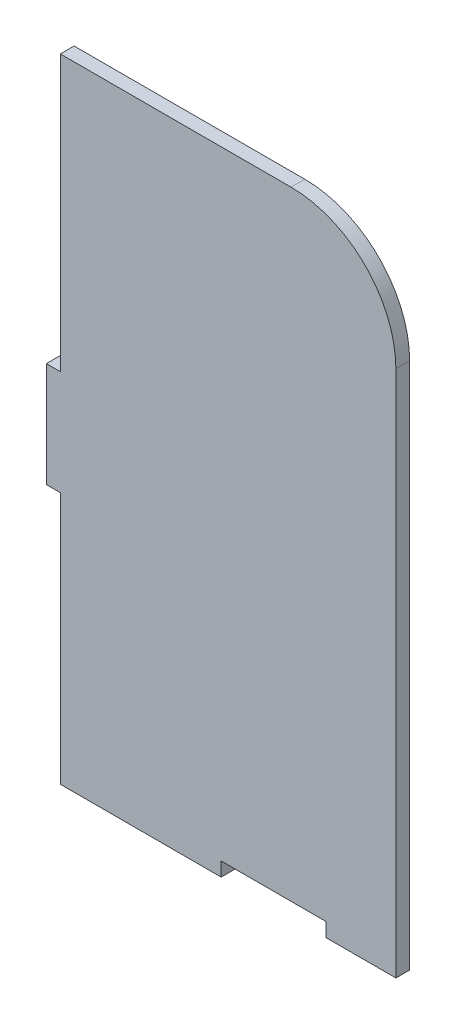
ISO-10303-21;
HEADER;
FILE_DESCRIPTION(('STEP AP214'),'2;1');
FILE_NAME('part.step','',(''),(''),'','','');
FILE_SCHEMA(('AUTOMOTIVE_DESIGN { 1 0 10303 214 1 1 1 1 }'));
ENDSEC;
DATA;
#1=APPLICATION_CONTEXT('core data for automotive mechanical design processes');
#2=APPLICATION_PROTOCOL_DEFINITION('international standard','automotive_design',2000,#1);
#3=PRODUCT_CONTEXT('',#1,'mechanical');
#4=PRODUCT('Part','Part','',(#3));
#5=PRODUCT_RELATED_PRODUCT_CATEGORY('part','',(#4));
#6=PRODUCT_DEFINITION_FORMATION('','',#4);
#7=PRODUCT_DEFINITION_CONTEXT('part definition',#1,'design');
#8=PRODUCT_DEFINITION('design','',#6,#7);
#9=PRODUCT_DEFINITION_SHAPE('','',#8);
#10=(LENGTH_UNIT() NAMED_UNIT(*) SI_UNIT(.MILLI.,.METRE.));
#11=(NAMED_UNIT(*) PLANE_ANGLE_UNIT() SI_UNIT($,.RADIAN.));
#12=(NAMED_UNIT(*) SI_UNIT($,.STERADIAN.) SOLID_ANGLE_UNIT());
#13=UNCERTAINTY_MEASURE_WITH_UNIT(LENGTH_MEASURE(1.E-05),#10,'distance_accuracy_value','');
#14=(GEOMETRIC_REPRESENTATION_CONTEXT(3) GLOBAL_UNCERTAINTY_ASSIGNED_CONTEXT((#13)) GLOBAL_UNIT_ASSIGNED_CONTEXT((#10,
#11,#12)) REPRESENTATION_CONTEXT('',''));
#15=CARTESIAN_POINT('',(0.,0.,0.));
#16=DIRECTION('',(0.,0.,1.));
#17=DIRECTION('',(1.,0.,0.));
#18=AXIS2_PLACEMENT_3D('',#15,#16,#17);
#19=CARTESIAN_POINT('',(215.829586762206,-10.1600000000001,-10.));
#20=DIRECTION('',(-1.,0.,0.));
#21=DIRECTION('',(0.,0.,1.));
#22=AXIS2_PLACEMENT_3D('',#19,#20,#21);
#23=PLANE('',#22);
#24=DIRECTION('',(0.,-1.,0.));
#25=VECTOR('',#24,1.);
#26=CARTESIAN_POINT('',(215.829586762206,-10.1600000000001,0.));
#27=LINE('',#26,#25);
#28=CARTESIAN_POINT('',(215.829586762206,-10.1600000000001,0.));
#29=VERTEX_POINT('',#28);
#30=CARTESIAN_POINT('',(215.829586762206,-210.16,0.));
#31=VERTEX_POINT('',#30);
#32=EDGE_CURVE('E164',#29,#31,#27,.T.);
#33=ORIENTED_EDGE('',*,*,#32,.F.);
#34=DIRECTION('',(0.,0.,1.));
#35=VECTOR('',#34,1.);
#36=CARTESIAN_POINT('',(215.829586762206,-10.1600000000001,-10.));
#37=LINE('',#36,#35);
#38=CARTESIAN_POINT('',(215.829586762206,-10.1600000000001,-10.));
#39=VERTEX_POINT('',#38);
#40=EDGE_CURVE('E11',#39,#29,#37,.T.);
#41=ORIENTED_EDGE('',*,*,#40,.F.);
#42=DIRECTION('',(0.,-1.,0.));
#43=VECTOR('',#42,1.);
#44=CARTESIAN_POINT('',(215.829586762206,-10.1600000000001,-10.));
#45=LINE('',#44,#43);
#46=CARTESIAN_POINT('',(215.829586762206,-210.16,-10.));
#47=VERTEX_POINT('',#46);
#48=EDGE_CURVE('E199',#39,#47,#45,.T.);
#49=ORIENTED_EDGE('',*,*,#48,.T.);
#50=DIRECTION('',(0.,0.,1.));
#51=VECTOR('',#50,1.);
#52=CARTESIAN_POINT('',(215.829586762206,-210.16,-10.));
#53=LINE('',#52,#51);
#54=EDGE_CURVE('E40',#47,#31,#53,.T.);
#55=ORIENTED_EDGE('',*,*,#54,.T.);
#56=EDGE_LOOP('',(#33,#41,#49,#55));
#57=FACE_BOUND('',#56,.T.);
#58=ADVANCED_FACE('F37',(#57),#23,.T.);
#59=CARTESIAN_POINT('',(215.829586762206,-10.1600000000001,-10.));
#60=DIRECTION('',(0.,1.,0.));
#61=DIRECTION('',(0.,0.,1.));
#62=AXIS2_PLACEMENT_3D('',#59,#60,#61);
#63=PLANE('',#62);
#64=DIRECTION('',(-1.,0.,0.));
#65=VECTOR('',#64,1.);
#66=CARTESIAN_POINT('',(215.829586762206,-10.1600000000001,0.));
#67=LINE('',#66,#65);
#68=CARTESIAN_POINT('',(383.521789204401,-10.1600000000001,0.));
#69=VERTEX_POINT('',#68);
#70=EDGE_CURVE('E197',#69,#29,#67,.T.);
#71=ORIENTED_EDGE('',*,*,#70,.F.);
#72=DIRECTION('',(0.,0.,1.));
#73=VECTOR('',#72,1.);
#74=CARTESIAN_POINT('',(383.521789204401,-10.1600000000001,-10.));
#75=LINE('',#74,#73);
#76=CARTESIAN_POINT('',(383.521789204401,-10.1600000000001,-10.));
#77=VERTEX_POINT('',#76);
#78=EDGE_CURVE('E46',#77,#69,#75,.T.);
#79=ORIENTED_EDGE('',*,*,#78,.F.);
#80=DIRECTION('',(-1.,0.,0.));
#81=VECTOR('',#80,1.);
#82=CARTESIAN_POINT('',(215.829586762206,-10.1600000000001,-10.));
#83=LINE('',#82,#81);
#84=EDGE_CURVE('E154',#77,#39,#83,.T.);
#85=ORIENTED_EDGE('',*,*,#84,.T.);
#86=ORIENTED_EDGE('',*,*,#40,.T.);
#87=EDGE_LOOP('',(#71,#79,#85,#86));
#88=FACE_BOUND('',#87,.T.);
#89=ADVANCED_FACE('F221',(#88),#63,.T.);
#90=CARTESIAN_POINT('',(383.521789204401,-86.3600000000001,-10.));
#91=DIRECTION('',(0.,0.,1.));
#92=DIRECTION('',(1.,0.,0.));
#93=AXIS2_PLACEMENT_3D('',#90,#91,#92);
#94=CYLINDRICAL_SURFACE('',#93,76.2);
#95=CARTESIAN_POINT('',(383.521789204401,-86.3600000000001,0.));
#96=DIRECTION('',(0.,0.,1.));
#97=DIRECTION('',(1.,0.,0.));
#98=AXIS2_PLACEMENT_3D('',#95,#96,#97);
#99=CIRCLE('',#98,76.2);
#100=CARTESIAN_POINT('',(459.721789204401,-86.3600000000001,0.));
#101=VERTEX_POINT('',#100);
#102=EDGE_CURVE('E141',#101,#69,#99,.T.);
#103=ORIENTED_EDGE('',*,*,#102,.F.);
#104=DIRECTION('',(0.,0.,1.));
#105=VECTOR('',#104,1.);
#106=CARTESIAN_POINT('',(459.721789204401,-86.3600000000001,-10.));
#107=LINE('',#106,#105);
#108=CARTESIAN_POINT('',(459.721789204401,-86.3600000000001,-10.));
#109=VERTEX_POINT('',#108);
#110=EDGE_CURVE('E136',#109,#101,#107,.T.);
#111=ORIENTED_EDGE('',*,*,#110,.F.);
#112=CARTESIAN_POINT('',(383.521789204401,-86.3600000000001,-10.));
#113=DIRECTION('',(0.,0.,1.));
#114=DIRECTION('',(1.,0.,0.));
#115=AXIS2_PLACEMENT_3D('',#112,#113,#114);
#116=CIRCLE('',#115,76.2);
#117=EDGE_CURVE('E139',#109,#77,#116,.T.);
#118=ORIENTED_EDGE('',*,*,#117,.T.);
#119=ORIENTED_EDGE('',*,*,#78,.T.);
#120=EDGE_LOOP('',(#103,#111,#118,#119));
#121=FACE_BOUND('',#120,.T.);
#122=ADVANCED_FACE('F138',(#121),#94,.T.);
#123=CARTESIAN_POINT('',(459.721789204401,-86.3600000000001,-10.));
#124=DIRECTION('',(1.,0.,0.));
#125=DIRECTION('',(0.,0.,-1.));
#126=AXIS2_PLACEMENT_3D('',#123,#124,#125);
#127=PLANE('',#126);
#128=DIRECTION('',(0.,1.,0.));
#129=VECTOR('',#128,1.);
#130=CARTESIAN_POINT('',(459.721789204401,-86.3600000000001,0.));
#131=LINE('',#130,#129);
#132=CARTESIAN_POINT('',(459.721789204401,-469.899999999951,0.));
#133=VERTEX_POINT('',#132);
#134=EDGE_CURVE('E194',#133,#101,#131,.T.);
#135=ORIENTED_EDGE('',*,*,#134,.F.);
#136=DIRECTION('',(0.,0.,1.));
#137=VECTOR('',#136,1.);
#138=CARTESIAN_POINT('',(459.721789204401,-469.899999999951,-10.));
#139=LINE('',#138,#137);
#140=CARTESIAN_POINT('',(459.721789204401,-469.899999999951,-10.));
#141=VERTEX_POINT('',#140);
#142=EDGE_CURVE('E146',#141,#133,#139,.T.);
#143=ORIENTED_EDGE('',*,*,#142,.F.);
#144=DIRECTION('',(0.,1.,0.));
#145=VECTOR('',#144,1.);
#146=CARTESIAN_POINT('',(459.721789204401,-86.3600000000001,-10.));
#147=LINE('',#146,#145);
#148=EDGE_CURVE('E152',#141,#109,#147,.T.);
#149=ORIENTED_EDGE('',*,*,#148,.T.);
#150=ORIENTED_EDGE('',*,*,#110,.T.);
#151=EDGE_LOOP('',(#135,#143,#149,#150));
#152=FACE_BOUND('',#151,.T.);
#153=ADVANCED_FACE('F156',(#152),#127,.T.);
#154=CARTESIAN_POINT('',(408.9217892044,-469.899999999951,-10.));
#155=DIRECTION('',(0.,-1.,0.));
#156=DIRECTION('',(1.,0.,0.));
#157=AXIS2_PLACEMENT_3D('',#154,#155,#156);
#158=PLANE('',#157);
#159=DIRECTION('',(1.,0.,0.));
#160=VECTOR('',#159,1.);
#161=CARTESIAN_POINT('',(408.9217892044,-469.899999999951,0.));
#162=LINE('',#161,#160);
#163=CARTESIAN_POINT('',(408.9217892044,-469.899999999951,0.));
#164=VERTEX_POINT('',#163);
#165=EDGE_CURVE('E191',#164,#133,#162,.T.);
#166=ORIENTED_EDGE('',*,*,#165,.F.);
#167=DIRECTION('',(0.,0.,1.));
#168=VECTOR('',#167,1.);
#169=CARTESIAN_POINT('',(408.9217892044,-469.899999999951,-10.));
#170=LINE('',#169,#168);
#171=CARTESIAN_POINT('',(408.9217892044,-469.899999999951,-10.));
#172=VERTEX_POINT('',#171);
#173=EDGE_CURVE('E203',#172,#164,#170,.T.);
#174=ORIENTED_EDGE('',*,*,#173,.F.);
#175=DIRECTION('',(1.,0.,0.));
#176=VECTOR('',#175,1.);
#177=CARTESIAN_POINT('',(408.9217892044,-469.899999999951,-10.));
#178=LINE('',#177,#176);
#179=EDGE_CURVE('E157',#172,#141,#178,.T.);
#180=ORIENTED_EDGE('',*,*,#179,.T.);
#181=ORIENTED_EDGE('',*,*,#142,.T.);
#182=EDGE_LOOP('',(#166,#174,#180,#181));
#183=FACE_BOUND('',#182,.T.);
#184=ADVANCED_FACE('F234',(#183),#158,.T.);
#185=CARTESIAN_POINT('',(408.9217892044,-469.899999999951,-10.));
#186=DIRECTION('',(-1.,0.,0.));
#187=DIRECTION('',(0.,0.,1.));
#188=AXIS2_PLACEMENT_3D('',#185,#186,#187);
#189=PLANE('',#188);
#190=DIRECTION('',(0.,-1.,0.));
#191=VECTOR('',#190,1.);
#192=CARTESIAN_POINT('',(408.9217892044,-469.899999999951,0.));
#193=LINE('',#192,#191);
#194=CARTESIAN_POINT('',(408.9217892044,-459.73999999995,0.));
#195=VERTEX_POINT('',#194);
#196=EDGE_CURVE('E188',#195,#164,#193,.T.);
#197=ORIENTED_EDGE('',*,*,#196,.F.);
#198=DIRECTION('',(0.,0.,1.));
#199=VECTOR('',#198,1.);
#200=CARTESIAN_POINT('',(408.9217892044,-459.73999999995,-10.));
#201=LINE('',#200,#199);
#202=CARTESIAN_POINT('',(408.9217892044,-459.73999999995,-10.));
#203=VERTEX_POINT('',#202);
#204=EDGE_CURVE('E205',#203,#195,#201,.T.);
#205=ORIENTED_EDGE('',*,*,#204,.F.);
#206=DIRECTION('',(0.,-1.,0.));
#207=VECTOR('',#206,1.);
#208=CARTESIAN_POINT('',(408.9217892044,-469.899999999951,-10.));
#209=LINE('',#208,#207);
#210=EDGE_CURVE('E159',#203,#172,#209,.T.);
#211=ORIENTED_EDGE('',*,*,#210,.T.);
#212=ORIENTED_EDGE('',*,*,#173,.T.);
#213=EDGE_LOOP('',(#197,#205,#211,#212));
#214=FACE_BOUND('',#213,.T.);
#215=ADVANCED_FACE('F237',(#214),#189,.T.);
#216=CARTESIAN_POINT('',(408.9217892044,-459.73999999995,-10.));
#217=DIRECTION('',(0.,-1.,0.));
#218=DIRECTION('',(0.,0.,-1.));
#219=AXIS2_PLACEMENT_3D('',#216,#217,#218);
#220=PLANE('',#219);
#221=DIRECTION('',(1.,0.,0.));
#222=VECTOR('',#221,1.);
#223=CARTESIAN_POINT('',(408.9217892044,-459.73999999995,0.));
#224=LINE('',#223,#222);
#225=CARTESIAN_POINT('',(332.7217892044,-459.73999999995,0.));
#226=VERTEX_POINT('',#225);
#227=EDGE_CURVE('E185',#226,#195,#224,.T.);
#228=ORIENTED_EDGE('',*,*,#227,.F.);
#229=DIRECTION('',(0.,0.,1.));
#230=VECTOR('',#229,1.);
#231=CARTESIAN_POINT('',(332.7217892044,-459.73999999995,-10.));
#232=LINE('',#231,#230);
#233=CARTESIAN_POINT('',(332.7217892044,-459.73999999995,-10.));
#234=VERTEX_POINT('',#233);
#235=EDGE_CURVE('E207',#234,#226,#232,.T.);
#236=ORIENTED_EDGE('',*,*,#235,.F.);
#237=DIRECTION('',(1.,0.,0.));
#238=VECTOR('',#237,1.);
#239=CARTESIAN_POINT('',(408.9217892044,-459.73999999995,-10.));
#240=LINE('',#239,#238);
#241=EDGE_CURVE('E407',#234,#203,#240,.T.);
#242=ORIENTED_EDGE('',*,*,#241,.T.);
#243=ORIENTED_EDGE('',*,*,#204,.T.);
#244=EDGE_LOOP('',(#228,#236,#242,#243));
#245=FACE_BOUND('',#244,.T.);
#246=ADVANCED_FACE('F241',(#245),#220,.T.);
#247=CARTESIAN_POINT('',(332.7217892044,-459.73999999995,-10.));
#248=DIRECTION('',(1.,0.,0.));
#249=DIRECTION('',(0.,0.,-1.));
#250=AXIS2_PLACEMENT_3D('',#247,#248,#249);
#251=PLANE('',#250);
#252=DIRECTION('',(0.,1.,0.));
#253=VECTOR('',#252,1.);
#254=CARTESIAN_POINT('',(332.7217892044,-459.73999999995,0.));
#255=LINE('',#254,#253);
#256=CARTESIAN_POINT('',(332.7217892044,-469.899999999951,0.));
#257=VERTEX_POINT('',#256);
#258=EDGE_CURVE('E182',#257,#226,#255,.T.);
#259=ORIENTED_EDGE('',*,*,#258,.F.);
#260=DIRECTION('',(0.,0.,1.));
#261=VECTOR('',#260,1.);
#262=CARTESIAN_POINT('',(332.7217892044,-469.899999999951,-10.));
#263=LINE('',#262,#261);
#264=CARTESIAN_POINT('',(332.7217892044,-469.899999999951,-10.));
#265=VERTEX_POINT('',#264);
#266=EDGE_CURVE('E209',#265,#257,#263,.T.);
#267=ORIENTED_EDGE('',*,*,#266,.F.);
#268=DIRECTION('',(0.,1.,0.));
#269=VECTOR('',#268,1.);
#270=CARTESIAN_POINT('',(332.7217892044,-459.73999999995,-10.));
#271=LINE('',#270,#269);
#272=EDGE_CURVE('E403',#265,#234,#271,.T.);
#273=ORIENTED_EDGE('',*,*,#272,.T.);
#274=ORIENTED_EDGE('',*,*,#235,.T.);
#275=EDGE_LOOP('',(#259,#267,#273,#274));
#276=FACE_BOUND('',#275,.T.);
#277=ADVANCED_FACE('F245',(#276),#251,.T.);
#278=CARTESIAN_POINT('',(215.829586762206,-469.9,-10.));
#279=DIRECTION('',(4.15055454191755E-13,-1.,0.));
#280=DIRECTION('',(1.,4.15055454191755E-13,0.));
#281=AXIS2_PLACEMENT_3D('',#278,#279,#280);
#282=PLANE('',#281);
#283=DIRECTION('',(1.,4.15055454191755E-13,0.));
#284=VECTOR('',#283,1.);
#285=CARTESIAN_POINT('',(215.829586762206,-469.9,0.));
#286=LINE('',#285,#284);
#287=CARTESIAN_POINT('',(215.829586762206,-469.9,0.));
#288=VERTEX_POINT('',#287);
#289=EDGE_CURVE('E179',#288,#257,#286,.T.);
#290=ORIENTED_EDGE('',*,*,#289,.F.);
#291=DIRECTION('',(0.,0.,1.));
#292=VECTOR('',#291,1.);
#293=CARTESIAN_POINT('',(215.829586762206,-469.9,-10.));
#294=LINE('',#293,#292);
#295=CARTESIAN_POINT('',(215.829586762206,-469.9,-10.));
#296=VERTEX_POINT('',#295);
#297=EDGE_CURVE('E211',#296,#288,#294,.T.);
#298=ORIENTED_EDGE('',*,*,#297,.F.);
#299=DIRECTION('',(1.,4.15055454191755E-13,0.));
#300=VECTOR('',#299,1.);
#301=CARTESIAN_POINT('',(215.829586762206,-469.9,-10.));
#302=LINE('',#301,#300);
#303=EDGE_CURVE('E414',#296,#265,#302,.T.);
#304=ORIENTED_EDGE('',*,*,#303,.T.);
#305=ORIENTED_EDGE('',*,*,#266,.T.);
#306=EDGE_LOOP('',(#290,#298,#304,#305));
#307=FACE_BOUND('',#306,.T.);
#308=ADVANCED_FACE('F249',(#307),#282,.T.);
#309=CARTESIAN_POINT('',(215.829586762206,-286.36,-10.));
#310=DIRECTION('',(-1.,0.,0.));
#311=DIRECTION('',(0.,-1.,0.));
#312=AXIS2_PLACEMENT_3D('',#309,#310,#311);
#313=PLANE('',#312);
#314=DIRECTION('',(0.,-1.,0.));
#315=VECTOR('',#314,1.);
#316=CARTESIAN_POINT('',(215.829586762206,-286.36,0.));
#317=LINE('',#316,#315);
#318=CARTESIAN_POINT('',(215.829586762206,-286.36,0.));
#319=VERTEX_POINT('',#318);
#320=EDGE_CURVE('E176',#319,#288,#317,.T.);
#321=ORIENTED_EDGE('',*,*,#320,.F.);
#322=DIRECTION('',(0.,0.,1.));
#323=VECTOR('',#322,1.);
#324=CARTESIAN_POINT('',(215.829586762206,-286.36,-10.));
#325=LINE('',#324,#323);
#326=CARTESIAN_POINT('',(215.829586762206,-286.36,-10.));
#327=VERTEX_POINT('',#326);
#328=EDGE_CURVE('E213',#327,#319,#325,.T.);
#329=ORIENTED_EDGE('',*,*,#328,.F.);
#330=DIRECTION('',(0.,-1.,0.));
#331=VECTOR('',#330,1.);
#332=CARTESIAN_POINT('',(215.829586762206,-286.36,-10.));
#333=LINE('',#332,#331);
#334=EDGE_CURVE('E396',#327,#296,#333,.T.);
#335=ORIENTED_EDGE('',*,*,#334,.T.);
#336=ORIENTED_EDGE('',*,*,#297,.T.);
#337=EDGE_LOOP('',(#321,#329,#335,#336));
#338=FACE_BOUND('',#337,.T.);
#339=ADVANCED_FACE('F253',(#338),#313,.T.);
#340=CARTESIAN_POINT('',(205.663096360818,-286.36,-10.));
#341=DIRECTION('',(0.,-1.,0.));
#342=DIRECTION('',(1.,0.,0.));
#343=AXIS2_PLACEMENT_3D('',#340,#341,#342);
#344=PLANE('',#343);
#345=DIRECTION('',(1.,0.,0.));
#346=VECTOR('',#345,1.);
#347=CARTESIAN_POINT('',(205.663096360818,-286.36,0.));
#348=LINE('',#347,#346);
#349=CARTESIAN_POINT('',(205.663096360818,-286.36,0.));
#350=VERTEX_POINT('',#349);
#351=EDGE_CURVE('E173',#350,#319,#348,.T.);
#352=ORIENTED_EDGE('',*,*,#351,.F.);
#353=DIRECTION('',(0.,0.,1.));
#354=VECTOR('',#353,1.);
#355=CARTESIAN_POINT('',(205.663096360818,-286.36,-10.));
#356=LINE('',#355,#354);
#357=CARTESIAN_POINT('',(205.663096360818,-286.36,-10.));
#358=VERTEX_POINT('',#357);
#359=EDGE_CURVE('E215',#358,#350,#356,.T.);
#360=ORIENTED_EDGE('',*,*,#359,.F.);
#361=DIRECTION('',(1.,0.,0.));
#362=VECTOR('',#361,1.);
#363=CARTESIAN_POINT('',(205.663096360818,-286.36,-10.));
#364=LINE('',#363,#362);
#365=EDGE_CURVE('E392',#358,#327,#364,.T.);
#366=ORIENTED_EDGE('',*,*,#365,.T.);
#367=ORIENTED_EDGE('',*,*,#328,.T.);
#368=EDGE_LOOP('',(#352,#360,#366,#367));
#369=FACE_BOUND('',#368,.T.);
#370=ADVANCED_FACE('F257',(#369),#344,.T.);
#371=CARTESIAN_POINT('',(205.663096360818,-210.16,-10.));
#372=DIRECTION('',(-1.,0.,0.));
#373=DIRECTION('',(0.,-1.,0.));
#374=AXIS2_PLACEMENT_3D('',#371,#372,#373);
#375=PLANE('',#374);
#376=DIRECTION('',(0.,-1.,0.));
#377=VECTOR('',#376,1.);
#378=CARTESIAN_POINT('',(205.663096360818,-210.16,0.));
#379=LINE('',#378,#377);
#380=CARTESIAN_POINT('',(205.663096360818,-210.16,0.));
#381=VERTEX_POINT('',#380);
#382=EDGE_CURVE('E170',#381,#350,#379,.T.);
#383=ORIENTED_EDGE('',*,*,#382,.F.);
#384=DIRECTION('',(0.,0.,1.));
#385=VECTOR('',#384,1.);
#386=CARTESIAN_POINT('',(205.663096360818,-210.16,-10.));
#387=LINE('',#386,#385);
#388=CARTESIAN_POINT('',(205.663096360818,-210.16,-10.));
#389=VERTEX_POINT('',#388);
#390=EDGE_CURVE('E216',#389,#381,#387,.T.);
#391=ORIENTED_EDGE('',*,*,#390,.F.);
#392=DIRECTION('',(0.,-1.,0.));
#393=VECTOR('',#392,1.);
#394=CARTESIAN_POINT('',(205.663096360818,-210.16,-10.));
#395=LINE('',#394,#393);
#396=EDGE_CURVE('E418',#389,#358,#395,.T.);
#397=ORIENTED_EDGE('',*,*,#396,.T.);
#398=ORIENTED_EDGE('',*,*,#359,.T.);
#399=EDGE_LOOP('',(#383,#391,#397,#398));
#400=FACE_BOUND('',#399,.T.);
#401=ADVANCED_FACE('F261',(#400),#375,.T.);
#402=CARTESIAN_POINT('',(215.829586762206,-210.16,-10.));
#403=DIRECTION('',(0.,1.,0.));
#404=DIRECTION('',(0.,0.,1.));
#405=AXIS2_PLACEMENT_3D('',#402,#403,#404);
#406=PLANE('',#405);
#407=DIRECTION('',(-1.,0.,0.));
#408=VECTOR('',#407,1.);
#409=CARTESIAN_POINT('',(215.829586762206,-210.16,0.));
#410=LINE('',#409,#408);
#411=EDGE_CURVE('E167',#31,#381,#410,.T.);
#412=ORIENTED_EDGE('',*,*,#411,.F.);
#413=ORIENTED_EDGE('',*,*,#54,.F.);
#414=DIRECTION('',(-1.,0.,0.));
#415=VECTOR('',#414,1.);
#416=CARTESIAN_POINT('',(215.829586762206,-210.16,-10.));
#417=LINE('',#416,#415);
#418=EDGE_CURVE('E420',#47,#389,#417,.T.);
#419=ORIENTED_EDGE('',*,*,#418,.T.);
#420=ORIENTED_EDGE('',*,*,#390,.T.);
#421=EDGE_LOOP('',(#412,#413,#419,#420));
#422=FACE_BOUND('',#421,.T.);
#423=ADVANCED_FACE('F218',(#422),#406,.T.);
#424=CARTESIAN_POINT('',(383.521789204401,-86.3600000000001,-10.));
#425=DIRECTION('',(0.,0.,1.));
#426=DIRECTION('',(1.,0.,0.));
#427=AXIS2_PLACEMENT_3D('',#424,#425,#426);
#428=PLANE('',#427);
#429=ORIENTED_EDGE('',*,*,#48,.F.);
#430=ORIENTED_EDGE('',*,*,#84,.F.);
#431=ORIENTED_EDGE('',*,*,#117,.F.);
#432=ORIENTED_EDGE('',*,*,#148,.F.);
#433=ORIENTED_EDGE('',*,*,#179,.F.);
#434=ORIENTED_EDGE('',*,*,#210,.F.);
#435=ORIENTED_EDGE('',*,*,#241,.F.);
#436=ORIENTED_EDGE('',*,*,#272,.F.);
#437=ORIENTED_EDGE('',*,*,#303,.F.);
#438=ORIENTED_EDGE('',*,*,#334,.F.);
#439=ORIENTED_EDGE('',*,*,#365,.F.);
#440=ORIENTED_EDGE('',*,*,#396,.F.);
#441=ORIENTED_EDGE('',*,*,#418,.F.);
#442=EDGE_LOOP('',(#429,#430,#431,#432,#433,#434,#435,#436,#437,#438,#439,#440,#441));
#443=FACE_BOUND('',#442,.T.);
#444=ADVANCED_FACE('F150',(#443),#428,.F.);
#445=CARTESIAN_POINT('',(383.521789204401,-86.3600000000001,0.));
#446=DIRECTION('',(0.,0.,1.));
#447=DIRECTION('',(1.,0.,0.));
#448=AXIS2_PLACEMENT_3D('',#445,#446,#447);
#449=PLANE('',#448);
#450=ORIENTED_EDGE('',*,*,#32,.T.);
#451=ORIENTED_EDGE('',*,*,#411,.T.);
#452=ORIENTED_EDGE('',*,*,#382,.T.);
#453=ORIENTED_EDGE('',*,*,#351,.T.);
#454=ORIENTED_EDGE('',*,*,#320,.T.);
#455=ORIENTED_EDGE('',*,*,#289,.T.);
#456=ORIENTED_EDGE('',*,*,#258,.T.);
#457=ORIENTED_EDGE('',*,*,#227,.T.);
#458=ORIENTED_EDGE('',*,*,#196,.T.);
#459=ORIENTED_EDGE('',*,*,#165,.T.);
#460=ORIENTED_EDGE('',*,*,#134,.T.);
#461=ORIENTED_EDGE('',*,*,#102,.T.);
#462=ORIENTED_EDGE('',*,*,#70,.T.);
#463=EDGE_LOOP('',(#450,#451,#452,#453,#454,#455,#456,#457,#458,#459,#460,#461,#462));
#464=FACE_BOUND('',#463,.T.);
#465=ADVANCED_FACE('F220',(#464),#449,.T.);
#466=CLOSED_SHELL('',(#58,#89,#122,#153,#184,#215,#246,#277,#308,#339,#370,#401,#423,#444,#465));
#467=MANIFOLD_SOLID_BREP('B2',#466);
#468=ADVANCED_BREP_SHAPE_REPRESENTATION('',(#18,#467),#14);
#469=SHAPE_DEFINITION_REPRESENTATION(#9,#468);
ENDSEC;
END-ISO-10303-21;
